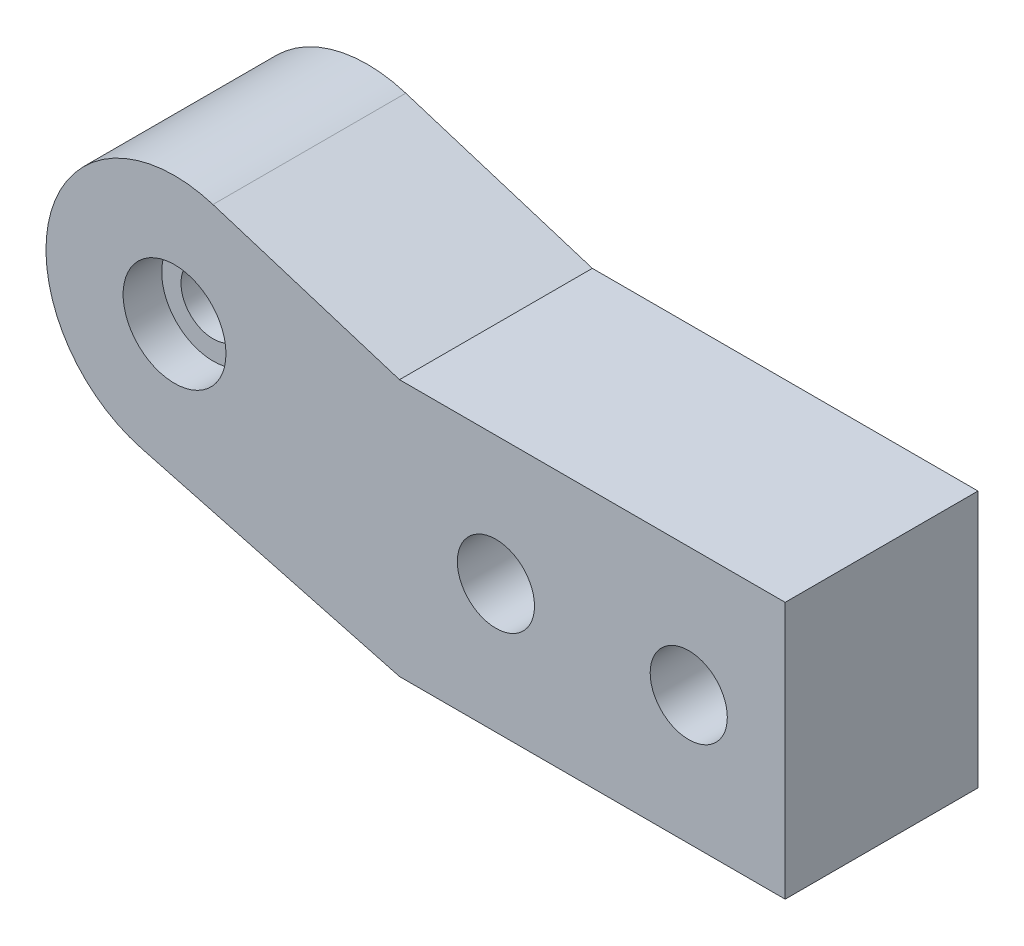
ISO-10303-21;
HEADER;
FILE_DESCRIPTION(('STEP AP214'),'2;1');
FILE_NAME('part.step','',(''),(''),'','','');
FILE_SCHEMA(('AUTOMOTIVE_DESIGN { 1 0 10303 214 1 1 1 1 }'));
ENDSEC;
DATA;
#1=APPLICATION_CONTEXT('core data for automotive mechanical design processes');
#2=APPLICATION_PROTOCOL_DEFINITION('international standard','automotive_design',2000,#1);
#3=PRODUCT_CONTEXT('',#1,'mechanical');
#4=PRODUCT('Part','Part','',(#3));
#5=PRODUCT_RELATED_PRODUCT_CATEGORY('part','',(#4));
#6=PRODUCT_DEFINITION_FORMATION('','',#4);
#7=PRODUCT_DEFINITION_CONTEXT('part definition',#1,'design');
#8=PRODUCT_DEFINITION('design','',#6,#7);
#9=PRODUCT_DEFINITION_SHAPE('','',#8);
#10=(LENGTH_UNIT() NAMED_UNIT(*) SI_UNIT(.MILLI.,.METRE.));
#11=(NAMED_UNIT(*) PLANE_ANGLE_UNIT() SI_UNIT($,.RADIAN.));
#12=(NAMED_UNIT(*) SI_UNIT($,.STERADIAN.) SOLID_ANGLE_UNIT());
#13=UNCERTAINTY_MEASURE_WITH_UNIT(LENGTH_MEASURE(1.E-05),#10,'distance_accuracy_value','');
#14=(GEOMETRIC_REPRESENTATION_CONTEXT(3) GLOBAL_UNCERTAINTY_ASSIGNED_CONTEXT((#13)) GLOBAL_UNIT_ASSIGNED_CONTEXT((#10,
#11,#12)) REPRESENTATION_CONTEXT('',''));
#15=CARTESIAN_POINT('',(0.,0.,0.));
#16=DIRECTION('',(0.,0.,1.));
#17=DIRECTION('',(1.,0.,0.));
#18=AXIS2_PLACEMENT_3D('',#15,#16,#17);
#19=CARTESIAN_POINT('',(-22.5,-10.,15.));
#20=DIRECTION('',(0.,0.,-1.));
#21=DIRECTION('',(-1.,0.,0.));
#22=AXIS2_PLACEMENT_3D('',#19,#20,#21);
#23=CYLINDRICAL_SURFACE('',#22,3.);
#24=CARTESIAN_POINT('',(-22.5,-10.,15.));
#25=DIRECTION('',(0.,0.,1.));
#26=DIRECTION('',(1.,0.,0.));
#27=AXIS2_PLACEMENT_3D('',#24,#25,#26);
#28=CIRCLE('',#27,3.);
#29=CARTESIAN_POINT('',(-19.5,-10.,15.));
#30=VERTEX_POINT('',#29);
#31=EDGE_CURVE('E133',#30,#30,#28,.T.);
#32=ORIENTED_EDGE('',*,*,#31,.T.);
#33=EDGE_LOOP('',(#32));
#34=FACE_BOUND('',#33,.T.);
#35=CARTESIAN_POINT('',(-22.5,-10.,6.));
#36=DIRECTION('',(0.,0.,-1.));
#37=DIRECTION('',(-1.,0.,0.));
#38=AXIS2_PLACEMENT_3D('',#35,#36,#37);
#39=CIRCLE('',#38,3.);
#40=CARTESIAN_POINT('',(-25.5,-10.,6.));
#41=VERTEX_POINT('',#40);
#42=EDGE_CURVE('E148',#41,#41,#39,.T.);
#43=ORIENTED_EDGE('',*,*,#42,.T.);
#44=EDGE_LOOP('',(#43));
#45=FACE_BOUND('',#44,.T.);
#46=ADVANCED_FACE('F41',(#34,#45),#23,.F.);
#47=CARTESIAN_POINT('',(-7.5,-10.,15.));
#48=DIRECTION('',(0.,0.,-1.));
#49=DIRECTION('',(-1.,0.,0.));
#50=AXIS2_PLACEMENT_3D('',#47,#48,#49);
#51=CYLINDRICAL_SURFACE('',#50,3.00000000000001);
#52=CARTESIAN_POINT('',(-7.5,-10.,15.));
#53=DIRECTION('',(0.,0.,1.));
#54=DIRECTION('',(1.,0.,0.));
#55=AXIS2_PLACEMENT_3D('',#52,#53,#54);
#56=CIRCLE('',#55,3.00000000000001);
#57=CARTESIAN_POINT('',(-4.49999999999999,-10.,15.));
#58=VERTEX_POINT('',#57);
#59=EDGE_CURVE('E151',#58,#58,#56,.T.);
#60=ORIENTED_EDGE('',*,*,#59,.T.);
#61=EDGE_LOOP('',(#60));
#62=FACE_BOUND('',#61,.T.);
#63=CARTESIAN_POINT('',(-7.5,-10.,6.));
#64=DIRECTION('',(0.,0.,-1.));
#65=DIRECTION('',(-1.,0.,0.));
#66=AXIS2_PLACEMENT_3D('',#63,#64,#65);
#67=CIRCLE('',#66,3.00000000000001);
#68=CARTESIAN_POINT('',(-10.5,-10.,6.));
#69=VERTEX_POINT('',#68);
#70=EDGE_CURVE('E146',#69,#69,#67,.T.);
#71=ORIENTED_EDGE('',*,*,#70,.T.);
#72=EDGE_LOOP('',(#71));
#73=FACE_BOUND('',#72,.T.);
#74=ADVANCED_FACE('F189',(#62,#73),#51,.F.);
#75=CARTESIAN_POINT('',(-47.5,-5.00000000000001,15.));
#76=DIRECTION('',(0.,0.,1.));
#77=DIRECTION('',(1.,0.,0.));
#78=AXIS2_PLACEMENT_3D('',#75,#76,#77);
#79=PLANE('',#78);
#80=CARTESIAN_POINT('',(-47.5,-5.00000000000001,15.));
#81=DIRECTION('',(0.,0.,1.));
#82=DIRECTION('',(1.,0.,0.));
#83=AXIS2_PLACEMENT_3D('',#80,#81,#82);
#84=CIRCLE('',#83,4.00000000000001);
#85=CARTESIAN_POINT('',(-43.5,-5.00000000000001,15.));
#86=VERTEX_POINT('',#85);
#87=EDGE_CURVE('E224',#86,#86,#84,.T.);
#88=ORIENTED_EDGE('',*,*,#87,.F.);
#89=EDGE_LOOP('',(#88));
#90=FACE_BOUND('',#89,.T.);
#91=ORIENTED_EDGE('',*,*,#31,.F.);
#92=EDGE_LOOP('',(#91));
#93=FACE_BOUND('',#92,.T.);
#94=DIRECTION('',(-0.954327126643161,0.298763678101954,0.));
#95=VECTOR('',#94,1.);
#96=CARTESIAN_POINT('',(-30.,0.,15.));
#97=LINE('',#96,#95);
#98=CARTESIAN_POINT('',(-30.,0.,15.));
#99=VERTEX_POINT('',#98);
#100=CARTESIAN_POINT('',(-44.5123632189805,4.54327126643161,15.));
#101=VERTEX_POINT('',#100);
#102=EDGE_CURVE('E140',#99,#101,#97,.T.);
#103=ORIENTED_EDGE('',*,*,#102,.T.);
#104=CARTESIAN_POINT('',(-47.5,-5.00000000000001,15.));
#105=DIRECTION('',(0.,0.,1.));
#106=DIRECTION('',(1.,0.,0.));
#107=AXIS2_PLACEMENT_3D('',#104,#105,#106);
#108=CIRCLE('',#107,10.);
#109=CARTESIAN_POINT('',(-50.0693815502951,-14.6642784753443,15.));
#110=VERTEX_POINT('',#109);
#111=EDGE_CURVE('E97',#101,#110,#108,.T.);
#112=ORIENTED_EDGE('',*,*,#111,.T.);
#113=DIRECTION('',(0.96642784753443,-0.256938155029511,0.));
#114=VECTOR('',#113,1.);
#115=CARTESIAN_POINT('',(-30.,-20.,15.));
#116=LINE('',#115,#114);
#117=CARTESIAN_POINT('',(-30.,-20.,15.));
#118=VERTEX_POINT('',#117);
#119=EDGE_CURVE('E111',#110,#118,#116,.T.);
#120=ORIENTED_EDGE('',*,*,#119,.T.);
#121=DIRECTION('',(1.,0.,0.));
#122=VECTOR('',#121,1.);
#123=CARTESIAN_POINT('',(0.,-20.,15.));
#124=LINE('',#123,#122);
#125=CARTESIAN_POINT('',(0.,-20.,15.));
#126=VERTEX_POINT('',#125);
#127=EDGE_CURVE('E104',#118,#126,#124,.T.);
#128=ORIENTED_EDGE('',*,*,#127,.T.);
#129=DIRECTION('',(0.,1.,0.));
#130=VECTOR('',#129,1.);
#131=CARTESIAN_POINT('',(0.,0.,15.));
#132=LINE('',#131,#130);
#133=CARTESIAN_POINT('',(0.,0.,15.));
#134=VERTEX_POINT('',#133);
#135=EDGE_CURVE('E109',#126,#134,#132,.T.);
#136=ORIENTED_EDGE('',*,*,#135,.T.);
#137=DIRECTION('',(-1.,0.,0.));
#138=VECTOR('',#137,1.);
#139=CARTESIAN_POINT('',(-30.,0.,15.));
#140=LINE('',#139,#138);
#141=EDGE_CURVE('E60',#134,#99,#140,.T.);
#142=ORIENTED_EDGE('',*,*,#141,.T.);
#143=EDGE_LOOP('',(#103,#112,#120,#128,#136,#142));
#144=FACE_BOUND('',#143,.T.);
#145=ORIENTED_EDGE('',*,*,#59,.F.);
#146=EDGE_LOOP('',(#145));
#147=FACE_BOUND('',#146,.T.);
#148=ADVANCED_FACE('F106',(#90,#93,#144,#147),#79,.T.);
#149=CARTESIAN_POINT('',(-47.5,-5.00000000000001,0.));
#150=DIRECTION('',(0.,0.,1.));
#151=DIRECTION('',(1.,0.,0.));
#152=AXIS2_PLACEMENT_3D('',#149,#150,#151);
#153=PLANE('',#152);
#154=CARTESIAN_POINT('',(-47.5,-5.00000000000001,0.));
#155=DIRECTION('',(0.,0.,1.));
#156=DIRECTION('',(1.,0.,0.));
#157=AXIS2_PLACEMENT_3D('',#154,#155,#156);
#158=CIRCLE('',#157,2.5);
#159=CARTESIAN_POINT('',(-45.,-5.00000000000001,0.));
#160=VERTEX_POINT('',#159);
#161=EDGE_CURVE('E45',#160,#160,#158,.T.);
#162=ORIENTED_EDGE('',*,*,#161,.T.);
#163=EDGE_LOOP('',(#162));
#164=FACE_BOUND('',#163,.T.);
#165=CARTESIAN_POINT('',(-7.5,-10.,0.));
#166=DIRECTION('',(0.,0.,-1.));
#167=DIRECTION('',(-1.,0.,0.));
#168=AXIS2_PLACEMENT_3D('',#165,#166,#167);
#169=CIRCLE('',#168,5.);
#170=CARTESIAN_POINT('',(-12.5,-10.,0.));
#171=VERTEX_POINT('',#170);
#172=EDGE_CURVE('E213',#171,#171,#169,.T.);
#173=ORIENTED_EDGE('',*,*,#172,.F.);
#174=EDGE_LOOP('',(#173));
#175=FACE_BOUND('',#174,.T.);
#176=CARTESIAN_POINT('',(-22.5,-10.,0.));
#177=DIRECTION('',(0.,0.,-1.));
#178=DIRECTION('',(-1.,0.,0.));
#179=AXIS2_PLACEMENT_3D('',#176,#177,#178);
#180=CIRCLE('',#179,5.);
#181=CARTESIAN_POINT('',(-27.5,-10.,0.));
#182=VERTEX_POINT('',#181);
#183=EDGE_CURVE('E216',#182,#182,#180,.T.);
#184=ORIENTED_EDGE('',*,*,#183,.F.);
#185=EDGE_LOOP('',(#184));
#186=FACE_BOUND('',#185,.T.);
#187=DIRECTION('',(-0.954327126643161,0.298763678101954,0.));
#188=VECTOR('',#187,1.);
#189=CARTESIAN_POINT('',(-30.,0.,0.));
#190=LINE('',#189,#188);
#191=CARTESIAN_POINT('',(-30.,0.,0.));
#192=VERTEX_POINT('',#191);
#193=CARTESIAN_POINT('',(-44.5123632189805,4.54327126643161,0.));
#194=VERTEX_POINT('',#193);
#195=EDGE_CURVE('E129',#192,#194,#190,.T.);
#196=ORIENTED_EDGE('',*,*,#195,.F.);
#197=DIRECTION('',(-1.,0.,0.));
#198=VECTOR('',#197,1.);
#199=CARTESIAN_POINT('',(-30.,0.,0.));
#200=LINE('',#199,#198);
#201=CARTESIAN_POINT('',(0.,0.,0.));
#202=VERTEX_POINT('',#201);
#203=EDGE_CURVE('E89',#202,#192,#200,.T.);
#204=ORIENTED_EDGE('',*,*,#203,.F.);
#205=DIRECTION('',(0.,1.,0.));
#206=VECTOR('',#205,1.);
#207=CARTESIAN_POINT('',(0.,0.,0.));
#208=LINE('',#207,#206);
#209=CARTESIAN_POINT('',(0.,-20.,0.));
#210=VERTEX_POINT('',#209);
#211=EDGE_CURVE('E83',#210,#202,#208,.T.);
#212=ORIENTED_EDGE('',*,*,#211,.F.);
#213=DIRECTION('',(1.,0.,0.));
#214=VECTOR('',#213,1.);
#215=CARTESIAN_POINT('',(0.,-20.,0.));
#216=LINE('',#215,#214);
#217=CARTESIAN_POINT('',(-30.,-20.,0.));
#218=VERTEX_POINT('',#217);
#219=EDGE_CURVE('E119',#218,#210,#216,.T.);
#220=ORIENTED_EDGE('',*,*,#219,.F.);
#221=DIRECTION('',(0.96642784753443,-0.256938155029511,0.));
#222=VECTOR('',#221,1.);
#223=CARTESIAN_POINT('',(-30.,-20.,0.));
#224=LINE('',#223,#222);
#225=CARTESIAN_POINT('',(-50.0693815502951,-14.6642784753443,0.));
#226=VERTEX_POINT('',#225);
#227=EDGE_CURVE('E135',#226,#218,#224,.T.);
#228=ORIENTED_EDGE('',*,*,#227,.F.);
#229=CARTESIAN_POINT('',(-47.5,-5.00000000000001,0.));
#230=DIRECTION('',(0.,0.,1.));
#231=DIRECTION('',(1.,0.,0.));
#232=AXIS2_PLACEMENT_3D('',#229,#230,#231);
#233=CIRCLE('',#232,10.);
#234=EDGE_CURVE('E132',#194,#226,#233,.T.);
#235=ORIENTED_EDGE('',*,*,#234,.F.);
#236=EDGE_LOOP('',(#196,#204,#212,#220,#228,#235));
#237=FACE_BOUND('',#236,.T.);
#238=ADVANCED_FACE('F173',(#164,#175,#186,#237),#153,.F.);
#239=CARTESIAN_POINT('',(-30.,0.,15.));
#240=DIRECTION('',(-0.298763678101954,-0.954327126643161,0.));
#241=DIRECTION('',(0.954327126643161,-0.298763678101954,0.));
#242=AXIS2_PLACEMENT_3D('',#239,#240,#241);
#243=PLANE('',#242);
#244=ORIENTED_EDGE('',*,*,#195,.T.);
#245=DIRECTION('',(0.,0.,-1.));
#246=VECTOR('',#245,1.);
#247=CARTESIAN_POINT('',(-44.5123632189805,4.54327126643161,15.));
#248=LINE('',#247,#246);
#249=EDGE_CURVE('E11',#101,#194,#248,.T.);
#250=ORIENTED_EDGE('',*,*,#249,.F.);
#251=ORIENTED_EDGE('',*,*,#102,.F.);
#252=DIRECTION('',(0.,0.,-1.));
#253=VECTOR('',#252,1.);
#254=CARTESIAN_POINT('',(-30.,0.,15.));
#255=LINE('',#254,#253);
#256=EDGE_CURVE('E125',#99,#192,#255,.T.);
#257=ORIENTED_EDGE('',*,*,#256,.T.);
#258=EDGE_LOOP('',(#244,#250,#251,#257));
#259=FACE_BOUND('',#258,.T.);
#260=ADVANCED_FACE('F43',(#259),#243,.F.);
#261=CARTESIAN_POINT('',(-47.5,-5.00000000000001,15.));
#262=DIRECTION('',(0.,0.,-1.));
#263=DIRECTION('',(-1.,0.,0.));
#264=AXIS2_PLACEMENT_3D('',#261,#262,#263);
#265=CYLINDRICAL_SURFACE('',#264,10.);
#266=ORIENTED_EDGE('',*,*,#234,.T.);
#267=DIRECTION('',(0.,0.,-1.));
#268=VECTOR('',#267,1.);
#269=CARTESIAN_POINT('',(-50.0693815502951,-14.6642784753443,15.));
#270=LINE('',#269,#268);
#271=EDGE_CURVE('E51',#110,#226,#270,.T.);
#272=ORIENTED_EDGE('',*,*,#271,.F.);
#273=ORIENTED_EDGE('',*,*,#111,.F.);
#274=ORIENTED_EDGE('',*,*,#249,.T.);
#275=EDGE_LOOP('',(#266,#272,#273,#274));
#276=FACE_BOUND('',#275,.T.);
#277=ADVANCED_FACE('F167',(#276),#265,.T.);
#278=CARTESIAN_POINT('',(-30.,-20.,15.));
#279=DIRECTION('',(0.256938155029511,0.96642784753443,0.));
#280=DIRECTION('',(-0.96642784753443,0.256938155029511,0.));
#281=AXIS2_PLACEMENT_3D('',#278,#279,#280);
#282=PLANE('',#281);
#283=ORIENTED_EDGE('',*,*,#227,.T.);
#284=DIRECTION('',(0.,0.,-1.));
#285=VECTOR('',#284,1.);
#286=CARTESIAN_POINT('',(-30.,-20.,15.));
#287=LINE('',#286,#285);
#288=EDGE_CURVE('E120',#118,#218,#287,.T.);
#289=ORIENTED_EDGE('',*,*,#288,.F.);
#290=ORIENTED_EDGE('',*,*,#119,.F.);
#291=ORIENTED_EDGE('',*,*,#271,.T.);
#292=EDGE_LOOP('',(#283,#289,#290,#291));
#293=FACE_BOUND('',#292,.T.);
#294=ADVANCED_FACE('F170',(#293),#282,.F.);
#295=CARTESIAN_POINT('',(0.,-20.,15.));
#296=DIRECTION('',(0.,1.,0.));
#297=DIRECTION('',(-1.,0.,0.));
#298=AXIS2_PLACEMENT_3D('',#295,#296,#297);
#299=PLANE('',#298);
#300=ORIENTED_EDGE('',*,*,#219,.T.);
#301=DIRECTION('',(0.,0.,-1.));
#302=VECTOR('',#301,1.);
#303=CARTESIAN_POINT('',(0.,-20.,15.));
#304=LINE('',#303,#302);
#305=EDGE_CURVE('E116',#126,#210,#304,.T.);
#306=ORIENTED_EDGE('',*,*,#305,.F.);
#307=ORIENTED_EDGE('',*,*,#127,.F.);
#308=ORIENTED_EDGE('',*,*,#288,.T.);
#309=EDGE_LOOP('',(#300,#306,#307,#308));
#310=FACE_BOUND('',#309,.T.);
#311=ADVANCED_FACE('F117',(#310),#299,.F.);
#312=CARTESIAN_POINT('',(0.,0.,15.));
#313=DIRECTION('',(-1.,0.,0.));
#314=DIRECTION('',(0.,0.,1.));
#315=AXIS2_PLACEMENT_3D('',#312,#313,#314);
#316=PLANE('',#315);
#317=ORIENTED_EDGE('',*,*,#211,.T.);
#318=DIRECTION('',(0.,0.,-1.));
#319=VECTOR('',#318,1.);
#320=CARTESIAN_POINT('',(0.,0.,15.));
#321=LINE('',#320,#319);
#322=EDGE_CURVE('E121',#134,#202,#321,.T.);
#323=ORIENTED_EDGE('',*,*,#322,.F.);
#324=ORIENTED_EDGE('',*,*,#135,.F.);
#325=ORIENTED_EDGE('',*,*,#305,.T.);
#326=EDGE_LOOP('',(#317,#323,#324,#325));
#327=FACE_BOUND('',#326,.T.);
#328=ADVANCED_FACE('F123',(#327),#316,.F.);
#329=CARTESIAN_POINT('',(-30.,0.,15.));
#330=DIRECTION('',(0.,-1.,0.));
#331=DIRECTION('',(0.,0.,-1.));
#332=AXIS2_PLACEMENT_3D('',#329,#330,#331);
#333=PLANE('',#332);
#334=ORIENTED_EDGE('',*,*,#203,.T.);
#335=ORIENTED_EDGE('',*,*,#256,.F.);
#336=ORIENTED_EDGE('',*,*,#141,.F.);
#337=ORIENTED_EDGE('',*,*,#322,.T.);
#338=EDGE_LOOP('',(#334,#335,#336,#337));
#339=FACE_BOUND('',#338,.T.);
#340=ADVANCED_FACE('F175',(#339),#333,.F.);
#341=CARTESIAN_POINT('',(-7.5,-10.,6.));
#342=DIRECTION('',(0.,0.,-1.));
#343=DIRECTION('',(-1.,0.,0.));
#344=AXIS2_PLACEMENT_3D('',#341,#342,#343);
#345=CYLINDRICAL_SURFACE('',#344,5.);
#346=CARTESIAN_POINT('',(-7.5,-10.,6.));
#347=DIRECTION('',(0.,0.,-1.));
#348=DIRECTION('',(-1.,0.,0.));
#349=AXIS2_PLACEMENT_3D('',#346,#347,#348);
#350=CIRCLE('',#349,5.);
#351=CARTESIAN_POINT('',(-12.5,-10.,6.));
#352=VERTEX_POINT('',#351);
#353=EDGE_CURVE('E149',#352,#352,#350,.T.);
#354=ORIENTED_EDGE('',*,*,#353,.F.);
#355=EDGE_LOOP('',(#354));
#356=FACE_BOUND('',#355,.T.);
#357=ORIENTED_EDGE('',*,*,#172,.T.);
#358=EDGE_LOOP('',(#357));
#359=FACE_BOUND('',#358,.T.);
#360=ADVANCED_FACE('F177',(#356,#359),#345,.F.);
#361=CARTESIAN_POINT('',(-7.5,-10.,6.));
#362=DIRECTION('',(0.,0.,-1.));
#363=DIRECTION('',(-1.,0.,0.));
#364=AXIS2_PLACEMENT_3D('',#361,#362,#363);
#365=PLANE('',#364);
#366=ORIENTED_EDGE('',*,*,#70,.F.);
#367=EDGE_LOOP('',(#366));
#368=FACE_BOUND('',#367,.T.);
#369=ORIENTED_EDGE('',*,*,#353,.T.);
#370=EDGE_LOOP('',(#369));
#371=FACE_BOUND('',#370,.T.);
#372=ADVANCED_FACE('F184',(#368,#371),#365,.T.);
#373=CARTESIAN_POINT('',(-22.5,-10.,6.));
#374=DIRECTION('',(0.,0.,-1.));
#375=DIRECTION('',(-1.,0.,0.));
#376=AXIS2_PLACEMENT_3D('',#373,#374,#375);
#377=CYLINDRICAL_SURFACE('',#376,5.);
#378=CARTESIAN_POINT('',(-22.5,-10.,6.));
#379=DIRECTION('',(0.,0.,-1.));
#380=DIRECTION('',(-1.,0.,0.));
#381=AXIS2_PLACEMENT_3D('',#378,#379,#380);
#382=CIRCLE('',#381,5.);
#383=CARTESIAN_POINT('',(-27.5,-10.,6.));
#384=VERTEX_POINT('',#383);
#385=EDGE_CURVE('E161',#384,#384,#382,.T.);
#386=ORIENTED_EDGE('',*,*,#385,.F.);
#387=EDGE_LOOP('',(#386));
#388=FACE_BOUND('',#387,.T.);
#389=ORIENTED_EDGE('',*,*,#183,.T.);
#390=EDGE_LOOP('',(#389));
#391=FACE_BOUND('',#390,.T.);
#392=ADVANCED_FACE('F251',(#388,#391),#377,.F.);
#393=CARTESIAN_POINT('',(-22.5,-10.,6.));
#394=DIRECTION('',(0.,0.,-1.));
#395=DIRECTION('',(-1.,0.,0.));
#396=AXIS2_PLACEMENT_3D('',#393,#394,#395);
#397=PLANE('',#396);
#398=ORIENTED_EDGE('',*,*,#42,.F.);
#399=EDGE_LOOP('',(#398));
#400=FACE_BOUND('',#399,.T.);
#401=ORIENTED_EDGE('',*,*,#385,.T.);
#402=EDGE_LOOP('',(#401));
#403=FACE_BOUND('',#402,.T.);
#404=ADVANCED_FACE('F243',(#400,#403),#397,.T.);
#405=CARTESIAN_POINT('',(-47.5,-5.00000000000001,12.));
#406=DIRECTION('',(0.,0.,1.));
#407=DIRECTION('',(1.,0.,0.));
#408=AXIS2_PLACEMENT_3D('',#405,#406,#407);
#409=CYLINDRICAL_SURFACE('',#408,4.00000000000001);
#410=CARTESIAN_POINT('',(-47.5,-5.00000000000001,12.));
#411=DIRECTION('',(0.,0.,1.));
#412=DIRECTION('',(1.,0.,0.));
#413=AXIS2_PLACEMENT_3D('',#410,#411,#412);
#414=CIRCLE('',#413,4.00000000000001);
#415=CARTESIAN_POINT('',(-43.5,-5.00000000000001,12.));
#416=VERTEX_POINT('',#415);
#417=EDGE_CURVE('E220',#416,#416,#414,.T.);
#418=ORIENTED_EDGE('',*,*,#417,.F.);
#419=EDGE_LOOP('',(#418));
#420=FACE_BOUND('',#419,.T.);
#421=ORIENTED_EDGE('',*,*,#87,.T.);
#422=EDGE_LOOP('',(#421));
#423=FACE_BOUND('',#422,.T.);
#424=ADVANCED_FACE('F238',(#420,#423),#409,.F.);
#425=CARTESIAN_POINT('',(-47.5,-5.00000000000001,12.));
#426=DIRECTION('',(0.,0.,1.));
#427=DIRECTION('',(1.,0.,0.));
#428=AXIS2_PLACEMENT_3D('',#425,#426,#427);
#429=PLANE('',#428);
#430=CARTESIAN_POINT('',(-47.5,-5.00000000000001,12.));
#431=DIRECTION('',(0.,0.,1.));
#432=DIRECTION('',(1.,0.,0.));
#433=AXIS2_PLACEMENT_3D('',#430,#431,#432);
#434=CIRCLE('',#433,2.5);
#435=CARTESIAN_POINT('',(-45.,-5.00000000000001,12.));
#436=VERTEX_POINT('',#435);
#437=EDGE_CURVE('E229',#436,#436,#434,.T.);
#438=ORIENTED_EDGE('',*,*,#437,.F.);
#439=EDGE_LOOP('',(#438));
#440=FACE_BOUND('',#439,.T.);
#441=ORIENTED_EDGE('',*,*,#417,.T.);
#442=EDGE_LOOP('',(#441));
#443=FACE_BOUND('',#442,.T.);
#444=ADVANCED_FACE('F236',(#440,#443),#429,.T.);
#445=CARTESIAN_POINT('',(-47.5,-5.00000000000001,-0.999999999999999));
#446=DIRECTION('',(0.,0.,1.));
#447=DIRECTION('',(1.,0.,0.));
#448=AXIS2_PLACEMENT_3D('',#445,#446,#447);
#449=CYLINDRICAL_SURFACE('',#448,2.5);
#450=CARTESIAN_POINT('',(-45.,-5.00000000000001,12.));
#451=CARTESIAN_POINT('',(-45.,-5.00000000000001,11.875));
#452=CARTESIAN_POINT('',(-45.,-5.00000000000001,11.75));
#453=CARTESIAN_POINT('',(-45.,-5.00000000000001,11.5));
#454=CARTESIAN_POINT('',(-45.,-5.00000000000001,11.375));
#455=CARTESIAN_POINT('',(-45.,-5.00000000000001,11.125));
#456=CARTESIAN_POINT('',(-45.,-5.00000000000001,11.));
#457=CARTESIAN_POINT('',(-45.,-5.00000000000001,10.75));
#458=CARTESIAN_POINT('',(-45.,-5.00000000000001,10.625));
#459=CARTESIAN_POINT('',(-45.,-5.00000000000001,10.375));
#460=CARTESIAN_POINT('',(-45.,-5.00000000000001,10.25));
#461=CARTESIAN_POINT('',(-45.,-5.00000000000001,10.));
#462=CARTESIAN_POINT('',(-45.,-5.00000000000001,9.875));
#463=CARTESIAN_POINT('',(-45.,-5.00000000000001,9.625));
#464=CARTESIAN_POINT('',(-45.,-5.00000000000001,9.5));
#465=CARTESIAN_POINT('',(-45.,-5.00000000000001,9.25));
#466=CARTESIAN_POINT('',(-45.,-5.00000000000001,9.125));
#467=CARTESIAN_POINT('',(-45.,-5.00000000000001,8.875));
#468=CARTESIAN_POINT('',(-45.,-5.00000000000001,8.75));
#469=CARTESIAN_POINT('',(-45.,-5.00000000000001,8.5));
#470=CARTESIAN_POINT('',(-45.,-5.00000000000001,8.375));
#471=CARTESIAN_POINT('',(-45.,-5.00000000000001,8.125));
#472=CARTESIAN_POINT('',(-45.,-5.00000000000001,8.));
#473=CARTESIAN_POINT('',(-45.,-5.00000000000001,7.75));
#474=CARTESIAN_POINT('',(-45.,-5.00000000000001,7.625));
#475=CARTESIAN_POINT('',(-45.,-5.00000000000001,7.375));
#476=CARTESIAN_POINT('',(-45.,-5.00000000000001,7.25));
#477=CARTESIAN_POINT('',(-45.,-5.00000000000001,7.));
#478=CARTESIAN_POINT('',(-45.,-5.00000000000001,6.875));
#479=CARTESIAN_POINT('',(-45.,-5.00000000000001,6.625));
#480=CARTESIAN_POINT('',(-45.,-5.00000000000001,6.5));
#481=CARTESIAN_POINT('',(-45.,-5.00000000000001,6.25));
#482=CARTESIAN_POINT('',(-45.,-5.00000000000001,6.125));
#483=CARTESIAN_POINT('',(-45.,-5.00000000000001,5.875));
#484=CARTESIAN_POINT('',(-45.,-5.00000000000001,5.75));
#485=CARTESIAN_POINT('',(-45.,-5.00000000000001,5.5));
#486=CARTESIAN_POINT('',(-45.,-5.00000000000001,5.375));
#487=CARTESIAN_POINT('',(-45.,-5.00000000000001,5.125));
#488=CARTESIAN_POINT('',(-45.,-5.00000000000001,5.));
#489=CARTESIAN_POINT('',(-45.,-5.00000000000001,4.75));
#490=CARTESIAN_POINT('',(-45.,-5.00000000000001,4.625));
#491=CARTESIAN_POINT('',(-45.,-5.00000000000001,4.375));
#492=CARTESIAN_POINT('',(-45.,-5.00000000000001,4.25));
#493=CARTESIAN_POINT('',(-45.,-5.00000000000001,4.));
#494=CARTESIAN_POINT('',(-45.,-5.00000000000001,3.875));
#495=CARTESIAN_POINT('',(-45.,-5.00000000000001,3.625));
#496=CARTESIAN_POINT('',(-45.,-5.00000000000001,3.5));
#497=CARTESIAN_POINT('',(-45.,-5.00000000000001,3.25));
#498=CARTESIAN_POINT('',(-45.,-5.00000000000001,3.125));
#499=CARTESIAN_POINT('',(-45.,-5.00000000000001,2.875));
#500=CARTESIAN_POINT('',(-45.,-5.00000000000001,2.75));
#501=CARTESIAN_POINT('',(-45.,-5.00000000000001,2.5));
#502=CARTESIAN_POINT('',(-45.,-5.00000000000001,2.375));
#503=CARTESIAN_POINT('',(-45.,-5.00000000000001,2.125));
#504=CARTESIAN_POINT('',(-45.,-5.00000000000001,2.));
#505=CARTESIAN_POINT('',(-45.,-5.00000000000001,1.75));
#506=CARTESIAN_POINT('',(-45.,-5.00000000000001,1.625));
#507=CARTESIAN_POINT('',(-45.,-5.00000000000001,1.375));
#508=CARTESIAN_POINT('',(-45.,-5.00000000000001,1.25));
#509=CARTESIAN_POINT('',(-45.,-5.00000000000001,1.));
#510=CARTESIAN_POINT('',(-45.,-5.00000000000001,0.875));
#511=CARTESIAN_POINT('',(-45.,-5.00000000000001,0.625));
#512=CARTESIAN_POINT('',(-45.,-5.00000000000001,0.5));
#513=CARTESIAN_POINT('',(-45.,-5.00000000000001,0.25));
#514=CARTESIAN_POINT('',(-45.,-5.00000000000001,0.125));
#515=CARTESIAN_POINT('',(-45.,-5.00000000000001,0.));
#516=B_SPLINE_CURVE_WITH_KNOTS('',3,(#450,#451,#452,#453,#454,#455,#456,#457,#458,#459,#460,
#461,#462,#463,#464,#465,#466,#467,#468,#469,#470,#471,#472,#473,#474,#475,#476,#477,#478,#479,
#480,#481,#482,#483,#484,#485,#486,#487,#488,#489,#490,#491,#492,#493,#494,#495,#496,#497,#498,
#499,#500,#501,#502,#503,#504,#505,#506,#507,#508,#509,#510,#511,#512,#513,#514,#515),
.UNSPECIFIED.,.F.,.F.,(4,2,2,2,2,2,2,2,2,2,2,2,2,2,2,2,2,2,2,2,2,2,2,2,2,2,2,2,2,2,2,2,4),(0.,
0.375,0.750000000000001,1.125,1.5,1.875,2.25,2.625,3.,3.375,3.75,4.125,4.5,4.875,5.25,5.625,6.,
6.375,6.75,7.125,7.5,7.875,8.25,8.625,9.,9.375,9.75,10.125,10.5,10.875,11.25,11.625,12.),.UNSPECIFIED.);
#517=EDGE_CURVE('BSEAM233',#436,#160,#516,.T.);
#518=ORIENTED_EDGE('',*,*,#437,.T.);
#519=ORIENTED_EDGE('',*,*,#161,.F.);
#520=ORIENTED_EDGE('',*,*,#517,.T.);
#521=ORIENTED_EDGE('',*,*,#517,.F.);
#522=EDGE_LOOP('',(#518,#520,#519,#521));
#523=FACE_BOUND('',#522,.T.);
#524=ADVANCED_FACE('F233',(#523),#449,.F.);
#525=CLOSED_SHELL('',(#46,#74,#148,#238,#260,#277,#294,#311,#328,#340,#360,#372,#392,#404,#424,
#444,#524));
#526=MANIFOLD_SOLID_BREP('B2',#525);
#527=ADVANCED_BREP_SHAPE_REPRESENTATION('',(#18,#526),#14);
#528=SHAPE_DEFINITION_REPRESENTATION(#9,#527);
ENDSEC;
END-ISO-10303-21;
